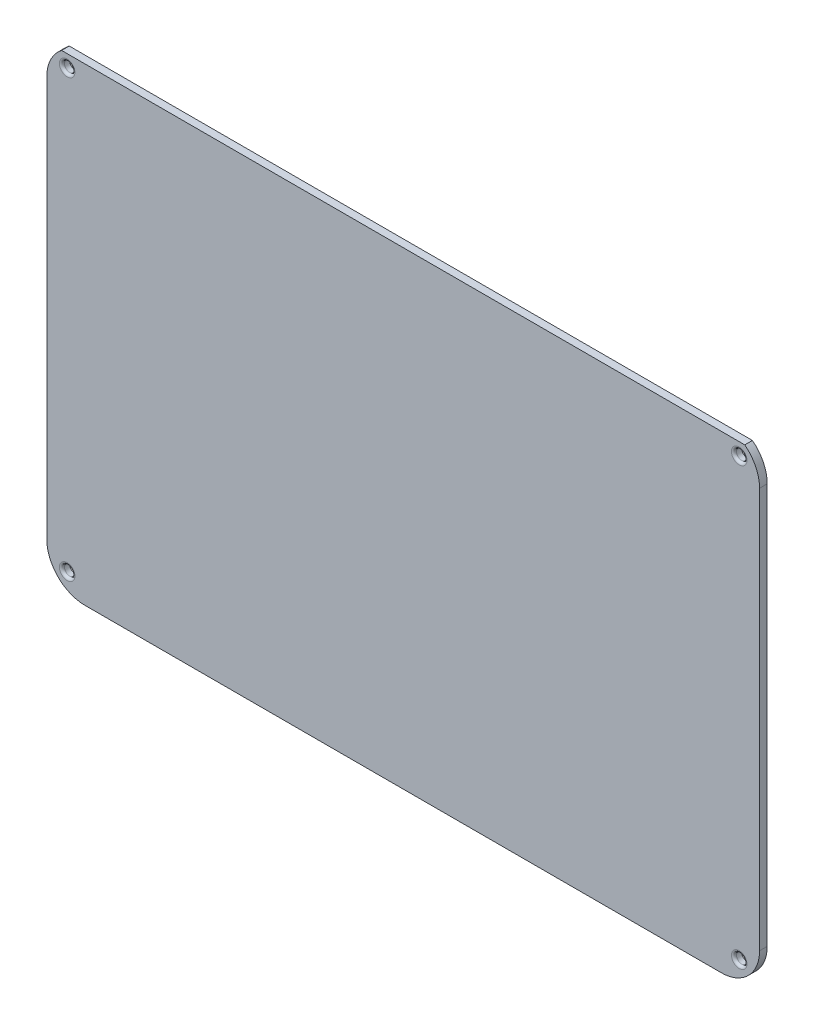
ISO-10303-21;
HEADER;
FILE_DESCRIPTION(('STEP AP214'),'2;1');
FILE_NAME('part.step','',(''),(''),'','','');
FILE_SCHEMA(('AUTOMOTIVE_DESIGN { 1 0 10303 214 1 1 1 1 }'));
ENDSEC;
DATA;
#1=APPLICATION_CONTEXT('core data for automotive mechanical design processes');
#2=APPLICATION_PROTOCOL_DEFINITION('international standard','automotive_design',2000,#1);
#3=PRODUCT_CONTEXT('',#1,'mechanical');
#4=PRODUCT('Part','Part','',(#3));
#5=PRODUCT_RELATED_PRODUCT_CATEGORY('part','',(#4));
#6=PRODUCT_DEFINITION_FORMATION('','',#4);
#7=PRODUCT_DEFINITION_CONTEXT('part definition',#1,'design');
#8=PRODUCT_DEFINITION('design','',#6,#7);
#9=PRODUCT_DEFINITION_SHAPE('','',#8);
#10=(LENGTH_UNIT() NAMED_UNIT(*) SI_UNIT(.MILLI.,.METRE.));
#11=(NAMED_UNIT(*) PLANE_ANGLE_UNIT() SI_UNIT($,.RADIAN.));
#12=(NAMED_UNIT(*) SI_UNIT($,.STERADIAN.) SOLID_ANGLE_UNIT());
#13=UNCERTAINTY_MEASURE_WITH_UNIT(LENGTH_MEASURE(1.E-05),#10,'distance_accuracy_value','');
#14=(GEOMETRIC_REPRESENTATION_CONTEXT(3) GLOBAL_UNCERTAINTY_ASSIGNED_CONTEXT((#13)) GLOBAL_UNIT_ASSIGNED_CONTEXT((#10,
#11,#12)) REPRESENTATION_CONTEXT('',''));
#15=CARTESIAN_POINT('',(0.,0.,0.));
#16=DIRECTION('',(0.,0.,1.));
#17=DIRECTION('',(1.,0.,0.));
#18=AXIS2_PLACEMENT_3D('',#15,#16,#17);
#19=CARTESIAN_POINT('',(0.,0.,0.));
#20=DIRECTION('',(0.,0.,1.));
#21=DIRECTION('',(1.,0.,0.));
#22=AXIS2_PLACEMENT_3D('',#19,#20,#21);
#23=PLANE('',#22);
#24=DIRECTION('',(1.,0.,0.));
#25=VECTOR('',#24,1.);
#26=CARTESIAN_POINT('',(0.,0.,0.));
#27=LINE('',#26,#25);
#28=CARTESIAN_POINT('',(-125.,0.,0.));
#29=VERTEX_POINT('',#28);
#30=CARTESIAN_POINT('',(125.,0.,0.));
#31=VERTEX_POINT('',#30);
#32=EDGE_CURVE('E233',#29,#31,#27,.T.);
#33=ORIENTED_EDGE('',*,*,#32,.F.);
#34=CARTESIAN_POINT('',(-125.,15.,0.));
#35=DIRECTION('',(0.,0.,1.));
#36=DIRECTION('',(1.,0.,0.));
#37=AXIS2_PLACEMENT_3D('',#34,#35,#36);
#38=CIRCLE('',#37,15.);
#39=CARTESIAN_POINT('',(-140.,15.,0.));
#40=VERTEX_POINT('',#39);
#41=EDGE_CURVE('E199',#40,#29,#38,.T.);
#42=ORIENTED_EDGE('',*,*,#41,.F.);
#43=DIRECTION('',(0.,1.,0.));
#44=VECTOR('',#43,1.);
#45=CARTESIAN_POINT('',(-140.,0.,0.));
#46=LINE('',#45,#44);
#47=CARTESIAN_POINT('',(-140.,172.349939951952,0.));
#48=VERTEX_POINT('',#47);
#49=EDGE_CURVE('E253',#40,#48,#46,.T.);
#50=ORIENTED_EDGE('',*,*,#49,.T.);
#51=CARTESIAN_POINT('',(-125.,172.349939951952,0.));
#52=DIRECTION('',(0.,0.,1.));
#53=DIRECTION('',(1.,0.,0.));
#54=AXIS2_PLACEMENT_3D('',#51,#52,#53);
#55=CIRCLE('',#54,15.);
#56=CARTESIAN_POINT('',(-134.189468511492,184.20547319497,0.));
#57=VERTEX_POINT('',#56);
#58=EDGE_CURVE('E249',#57,#48,#55,.T.);
#59=ORIENTED_EDGE('',*,*,#58,.F.);
#60=DIRECTION('',(-1.,0.,0.));
#61=VECTOR('',#60,1.);
#62=CARTESIAN_POINT('',(0.,184.20547319497,0.));
#63=LINE('',#62,#61);
#64=CARTESIAN_POINT('',(134.189468511492,184.20547319497,0.));
#65=VERTEX_POINT('',#64);
#66=EDGE_CURVE('E246',#65,#57,#63,.T.);
#67=ORIENTED_EDGE('',*,*,#66,.F.);
#68=CARTESIAN_POINT('',(125.,172.349939951952,0.));
#69=DIRECTION('',(0.,0.,1.));
#70=DIRECTION('',(1.,0.,0.));
#71=AXIS2_PLACEMENT_3D('',#68,#69,#70);
#72=CIRCLE('',#71,15.);
#73=CARTESIAN_POINT('',(140.,172.349939951952,0.));
#74=VERTEX_POINT('',#73);
#75=EDGE_CURVE('E243',#74,#65,#72,.T.);
#76=ORIENTED_EDGE('',*,*,#75,.F.);
#77=DIRECTION('',(0.,1.,0.));
#78=VECTOR('',#77,1.);
#79=CARTESIAN_POINT('',(140.,0.,0.));
#80=LINE('',#79,#78);
#81=CARTESIAN_POINT('',(140.,15.,0.));
#82=VERTEX_POINT('',#81);
#83=EDGE_CURVE('E240',#82,#74,#80,.T.);
#84=ORIENTED_EDGE('',*,*,#83,.F.);
#85=CARTESIAN_POINT('',(125.,15.,0.));
#86=DIRECTION('',(0.,0.,1.));
#87=DIRECTION('',(1.,0.,0.));
#88=AXIS2_PLACEMENT_3D('',#85,#86,#87);
#89=CIRCLE('',#88,15.);
#90=EDGE_CURVE('E237',#31,#82,#89,.T.);
#91=ORIENTED_EDGE('',*,*,#90,.F.);
#92=EDGE_LOOP('',(#33,#42,#50,#59,#67,#76,#84,#91));
#93=FACE_BOUND('',#92,.T.);
#94=CARTESIAN_POINT('',(132.,179.349939951952,0.));
#95=DIRECTION('',(0.,0.,1.));
#96=DIRECTION('',(1.,0.,0.));
#97=AXIS2_PLACEMENT_3D('',#94,#95,#96);
#98=CIRCLE('',#97,2.04999999999999);
#99=CARTESIAN_POINT('',(134.05,179.349939951952,0.));
#100=VERTEX_POINT('',#99);
#101=EDGE_CURVE('E229',#100,#100,#98,.T.);
#102=ORIENTED_EDGE('',*,*,#101,.T.);
#103=EDGE_LOOP('',(#102));
#104=FACE_BOUND('',#103,.T.);
#105=CARTESIAN_POINT('',(132.,8.,0.));
#106=DIRECTION('',(0.,0.,1.));
#107=DIRECTION('',(1.,0.,0.));
#108=AXIS2_PLACEMENT_3D('',#105,#106,#107);
#109=CIRCLE('',#108,2.04999999999999);
#110=CARTESIAN_POINT('',(134.05,8.,0.));
#111=VERTEX_POINT('',#110);
#112=EDGE_CURVE('E225',#111,#111,#109,.T.);
#113=ORIENTED_EDGE('',*,*,#112,.T.);
#114=EDGE_LOOP('',(#113));
#115=FACE_BOUND('',#114,.T.);
#116=CARTESIAN_POINT('',(-132.,8.,0.));
#117=DIRECTION('',(0.,0.,1.));
#118=DIRECTION('',(1.,0.,0.));
#119=AXIS2_PLACEMENT_3D('',#116,#117,#118);
#120=CIRCLE('',#119,2.04999999999999);
#121=CARTESIAN_POINT('',(-129.95,8.,0.));
#122=VERTEX_POINT('',#121);
#123=EDGE_CURVE('E188',#122,#122,#120,.T.);
#124=ORIENTED_EDGE('',*,*,#123,.T.);
#125=EDGE_LOOP('',(#124));
#126=FACE_BOUND('',#125,.T.);
#127=CARTESIAN_POINT('',(-132.,179.349939951952,0.));
#128=DIRECTION('',(0.,0.,1.));
#129=DIRECTION('',(1.,0.,0.));
#130=AXIS2_PLACEMENT_3D('',#127,#128,#129);
#131=CIRCLE('',#130,2.04999999999999);
#132=CARTESIAN_POINT('',(-129.95,179.349939951952,0.));
#133=VERTEX_POINT('',#132);
#134=EDGE_CURVE('E183',#133,#133,#131,.T.);
#135=ORIENTED_EDGE('',*,*,#134,.T.);
#136=EDGE_LOOP('',(#135));
#137=FACE_BOUND('',#136,.T.);
#138=CARTESIAN_POINT('',(-125.,10.,0.));
#139=DIRECTION('',(0.,0.,-1.));
#140=DIRECTION('',(-1.,0.,0.));
#141=AXIS2_PLACEMENT_3D('',#138,#139,#140);
#142=CIRCLE('',#141,1.59999999999999);
#143=CARTESIAN_POINT('',(-125.,8.40000000000001,0.));
#144=VERTEX_POINT('',#143);
#145=CARTESIAN_POINT('',(-126.6,10.,0.));
#146=VERTEX_POINT('',#145);
#147=EDGE_CURVE('E181',#144,#146,#142,.T.);
#148=ORIENTED_EDGE('',*,*,#147,.F.);
#149=DIRECTION('',(-1.,0.,0.));
#150=VECTOR('',#149,1.);
#151=CARTESIAN_POINT('',(125.,8.4,0.));
#152=LINE('',#151,#150);
#153=CARTESIAN_POINT('',(125.,8.4,0.));
#154=VERTEX_POINT('',#153);
#155=EDGE_CURVE('E178',#154,#144,#152,.T.);
#156=ORIENTED_EDGE('',*,*,#155,.F.);
#157=CARTESIAN_POINT('',(125.,10.,0.));
#158=DIRECTION('',(0.,0.,-1.));
#159=DIRECTION('',(-1.,0.,0.));
#160=AXIS2_PLACEMENT_3D('',#157,#158,#159);
#161=CIRCLE('',#160,1.59999999999997);
#162=CARTESIAN_POINT('',(126.6,10.,0.));
#163=VERTEX_POINT('',#162);
#164=EDGE_CURVE('E415',#163,#154,#161,.T.);
#165=ORIENTED_EDGE('',*,*,#164,.F.);
#166=DIRECTION('',(0.,-1.,0.));
#167=VECTOR('',#166,1.);
#168=CARTESIAN_POINT('',(126.6,177.349939951952,0.));
#169=LINE('',#168,#167);
#170=CARTESIAN_POINT('',(126.6,177.349939951952,0.));
#171=VERTEX_POINT('',#170);
#172=EDGE_CURVE('E460',#171,#163,#169,.T.);
#173=ORIENTED_EDGE('',*,*,#172,.F.);
#174=CARTESIAN_POINT('',(125.,177.349939951952,0.));
#175=DIRECTION('',(0.,0.,-1.));
#176=DIRECTION('',(-1.,0.,0.));
#177=AXIS2_PLACEMENT_3D('',#174,#175,#176);
#178=CIRCLE('',#177,1.59999999999999);
#179=CARTESIAN_POINT('',(125.,178.949939951952,0.));
#180=VERTEX_POINT('',#179);
#181=EDGE_CURVE('E453',#180,#171,#178,.T.);
#182=ORIENTED_EDGE('',*,*,#181,.F.);
#183=DIRECTION('',(1.,0.,0.));
#184=VECTOR('',#183,1.);
#185=CARTESIAN_POINT('',(-125.,178.949939951952,0.));
#186=LINE('',#185,#184);
#187=CARTESIAN_POINT('',(-125.,178.949939951952,0.));
#188=VERTEX_POINT('',#187);
#189=EDGE_CURVE('E445',#188,#180,#186,.T.);
#190=ORIENTED_EDGE('',*,*,#189,.F.);
#191=CARTESIAN_POINT('',(-125.,177.349939951952,0.));
#192=DIRECTION('',(0.,0.,-1.));
#193=DIRECTION('',(-1.,0.,0.));
#194=AXIS2_PLACEMENT_3D('',#191,#192,#193);
#195=CIRCLE('',#194,1.59999999999999);
#196=CARTESIAN_POINT('',(-126.6,177.349939951952,0.));
#197=VERTEX_POINT('',#196);
#198=EDGE_CURVE('E66',#197,#188,#195,.T.);
#199=ORIENTED_EDGE('',*,*,#198,.F.);
#200=DIRECTION('',(0.,1.,0.));
#201=VECTOR('',#200,1.);
#202=CARTESIAN_POINT('',(-126.6,10.,0.));
#203=LINE('',#202,#201);
#204=EDGE_CURVE('E61',#146,#197,#203,.T.);
#205=ORIENTED_EDGE('',*,*,#204,.F.);
#206=EDGE_LOOP('',(#148,#156,#165,#173,#182,#190,#199,#205));
#207=FACE_BOUND('',#206,.T.);
#208=ADVANCED_FACE('F45',(#93,#104,#115,#126,#137,#207),#23,.F.);
#209=CARTESIAN_POINT('',(0.,0.,3.));
#210=DIRECTION('',(0.,1.,0.));
#211=DIRECTION('',(0.,0.,1.));
#212=AXIS2_PLACEMENT_3D('',#209,#210,#211);
#213=PLANE('',#212);
#214=ORIENTED_EDGE('',*,*,#32,.T.);
#215=DIRECTION('',(0.,0.,-1.));
#216=VECTOR('',#215,1.);
#217=CARTESIAN_POINT('',(125.,0.,3.));
#218=LINE('',#217,#216);
#219=CARTESIAN_POINT('',(125.,0.,3.));
#220=VERTEX_POINT('',#219);
#221=EDGE_CURVE('E284',#220,#31,#218,.T.);
#222=ORIENTED_EDGE('',*,*,#221,.F.);
#223=DIRECTION('',(1.,0.,0.));
#224=VECTOR('',#223,1.);
#225=CARTESIAN_POINT('',(0.,0.,3.));
#226=LINE('',#225,#224);
#227=CARTESIAN_POINT('',(-125.,0.,3.));
#228=VERTEX_POINT('',#227);
#229=EDGE_CURVE('E194',#228,#220,#226,.T.);
#230=ORIENTED_EDGE('',*,*,#229,.F.);
#231=DIRECTION('',(0.,0.,-1.));
#232=VECTOR('',#231,1.);
#233=CARTESIAN_POINT('',(-125.,0.,3.));
#234=LINE('',#233,#232);
#235=EDGE_CURVE('E220',#228,#29,#234,.T.);
#236=ORIENTED_EDGE('',*,*,#235,.T.);
#237=EDGE_LOOP('',(#214,#222,#230,#236));
#238=FACE_BOUND('',#237,.T.);
#239=ADVANCED_FACE('F332',(#238),#213,.F.);
#240=CARTESIAN_POINT('',(125.,15.,3.));
#241=DIRECTION('',(0.,0.,-1.));
#242=DIRECTION('',(-1.,0.,0.));
#243=AXIS2_PLACEMENT_3D('',#240,#241,#242);
#244=CYLINDRICAL_SURFACE('',#243,15.);
#245=ORIENTED_EDGE('',*,*,#90,.T.);
#246=DIRECTION('',(0.,0.,-1.));
#247=VECTOR('',#246,1.);
#248=CARTESIAN_POINT('',(140.,15.,3.));
#249=LINE('',#248,#247);
#250=CARTESIAN_POINT('',(140.,15.,3.));
#251=VERTEX_POINT('',#250);
#252=EDGE_CURVE('E280',#251,#82,#249,.T.);
#253=ORIENTED_EDGE('',*,*,#252,.F.);
#254=CARTESIAN_POINT('',(125.,15.,3.));
#255=DIRECTION('',(0.,0.,1.));
#256=DIRECTION('',(1.,0.,0.));
#257=AXIS2_PLACEMENT_3D('',#254,#255,#256);
#258=CIRCLE('',#257,15.);
#259=EDGE_CURVE('E198',#220,#251,#258,.T.);
#260=ORIENTED_EDGE('',*,*,#259,.F.);
#261=ORIENTED_EDGE('',*,*,#221,.T.);
#262=EDGE_LOOP('',(#245,#253,#260,#261));
#263=FACE_BOUND('',#262,.T.);
#264=ADVANCED_FACE('F340',(#263),#244,.T.);
#265=CARTESIAN_POINT('',(140.,0.,3.));
#266=DIRECTION('',(-1.,0.,0.));
#267=DIRECTION('',(0.,0.,1.));
#268=AXIS2_PLACEMENT_3D('',#265,#266,#267);
#269=PLANE('',#268);
#270=ORIENTED_EDGE('',*,*,#83,.T.);
#271=DIRECTION('',(0.,0.,-1.));
#272=VECTOR('',#271,1.);
#273=CARTESIAN_POINT('',(140.,172.349939951952,3.));
#274=LINE('',#273,#272);
#275=CARTESIAN_POINT('',(140.,172.349939951952,3.));
#276=VERTEX_POINT('',#275);
#277=EDGE_CURVE('E276',#276,#74,#274,.T.);
#278=ORIENTED_EDGE('',*,*,#277,.F.);
#279=DIRECTION('',(0.,1.,0.));
#280=VECTOR('',#279,1.);
#281=CARTESIAN_POINT('',(140.,0.,3.));
#282=LINE('',#281,#280);
#283=EDGE_CURVE('E202',#251,#276,#282,.T.);
#284=ORIENTED_EDGE('',*,*,#283,.F.);
#285=ORIENTED_EDGE('',*,*,#252,.T.);
#286=EDGE_LOOP('',(#270,#278,#284,#285));
#287=FACE_BOUND('',#286,.T.);
#288=ADVANCED_FACE('F368',(#287),#269,.F.);
#289=CARTESIAN_POINT('',(125.,172.349939951952,3.));
#290=DIRECTION('',(0.,0.,-1.));
#291=DIRECTION('',(-1.,0.,0.));
#292=AXIS2_PLACEMENT_3D('',#289,#290,#291);
#293=CYLINDRICAL_SURFACE('',#292,15.);
#294=ORIENTED_EDGE('',*,*,#75,.T.);
#295=DIRECTION('',(0.,0.,-1.));
#296=VECTOR('',#295,1.);
#297=CARTESIAN_POINT('',(134.189468511492,184.20547319497,3.));
#298=LINE('',#297,#296);
#299=CARTESIAN_POINT('',(134.189468511492,184.20547319497,3.));
#300=VERTEX_POINT('',#299);
#301=EDGE_CURVE('E272',#300,#65,#298,.T.);
#302=ORIENTED_EDGE('',*,*,#301,.F.);
#303=CARTESIAN_POINT('',(125.,172.349939951952,3.));
#304=DIRECTION('',(0.,0.,1.));
#305=DIRECTION('',(1.,0.,0.));
#306=AXIS2_PLACEMENT_3D('',#303,#304,#305);
#307=CIRCLE('',#306,15.);
#308=EDGE_CURVE('E205',#276,#300,#307,.T.);
#309=ORIENTED_EDGE('',*,*,#308,.F.);
#310=ORIENTED_EDGE('',*,*,#277,.T.);
#311=EDGE_LOOP('',(#294,#302,#309,#310));
#312=FACE_BOUND('',#311,.T.);
#313=ADVANCED_FACE('F364',(#312),#293,.T.);
#314=CARTESIAN_POINT('',(0.,184.20547319497,3.));
#315=DIRECTION('',(0.,-1.,0.));
#316=DIRECTION('',(0.,0.,-1.));
#317=AXIS2_PLACEMENT_3D('',#314,#315,#316);
#318=PLANE('',#317);
#319=ORIENTED_EDGE('',*,*,#66,.T.);
#320=DIRECTION('',(0.,0.,-1.));
#321=VECTOR('',#320,1.);
#322=CARTESIAN_POINT('',(-134.189468511492,184.20547319497,3.));
#323=LINE('',#322,#321);
#324=CARTESIAN_POINT('',(-134.189468511492,184.20547319497,3.));
#325=VERTEX_POINT('',#324);
#326=EDGE_CURVE('E268',#325,#57,#323,.T.);
#327=ORIENTED_EDGE('',*,*,#326,.F.);
#328=DIRECTION('',(-1.,0.,0.));
#329=VECTOR('',#328,1.);
#330=CARTESIAN_POINT('',(0.,184.20547319497,3.));
#331=LINE('',#330,#329);
#332=EDGE_CURVE('E208',#300,#325,#331,.T.);
#333=ORIENTED_EDGE('',*,*,#332,.F.);
#334=ORIENTED_EDGE('',*,*,#301,.T.);
#335=EDGE_LOOP('',(#319,#327,#333,#334));
#336=FACE_BOUND('',#335,.T.);
#337=ADVANCED_FACE('F360',(#336),#318,.F.);
#338=CARTESIAN_POINT('',(-125.,172.349939951952,3.));
#339=DIRECTION('',(0.,0.,-1.));
#340=DIRECTION('',(-1.,0.,0.));
#341=AXIS2_PLACEMENT_3D('',#338,#339,#340);
#342=CYLINDRICAL_SURFACE('',#341,15.);
#343=ORIENTED_EDGE('',*,*,#58,.T.);
#344=DIRECTION('',(0.,0.,-1.));
#345=VECTOR('',#344,1.);
#346=CARTESIAN_POINT('',(-140.,172.349939951952,3.));
#347=LINE('',#346,#345);
#348=CARTESIAN_POINT('',(-140.,172.349939951952,3.));
#349=VERTEX_POINT('',#348);
#350=EDGE_CURVE('E265',#349,#48,#347,.T.);
#351=ORIENTED_EDGE('',*,*,#350,.F.);
#352=CARTESIAN_POINT('',(-125.,172.349939951952,3.));
#353=DIRECTION('',(0.,0.,1.));
#354=DIRECTION('',(1.,0.,0.));
#355=AXIS2_PLACEMENT_3D('',#352,#353,#354);
#356=CIRCLE('',#355,15.);
#357=EDGE_CURVE('E211',#325,#349,#356,.T.);
#358=ORIENTED_EDGE('',*,*,#357,.F.);
#359=ORIENTED_EDGE('',*,*,#326,.T.);
#360=EDGE_LOOP('',(#343,#351,#358,#359));
#361=FACE_BOUND('',#360,.T.);
#362=ADVANCED_FACE('F356',(#361),#342,.T.);
#363=CARTESIAN_POINT('',(-140.,0.,3.));
#364=DIRECTION('',(-1.,0.,0.));
#365=DIRECTION('',(0.,0.,1.));
#366=AXIS2_PLACEMENT_3D('',#363,#364,#365);
#367=PLANE('',#366);
#368=ORIENTED_EDGE('',*,*,#49,.F.);
#369=DIRECTION('',(0.,0.,-1.));
#370=VECTOR('',#369,1.);
#371=CARTESIAN_POINT('',(-140.,15.,3.));
#372=LINE('',#371,#370);
#373=CARTESIAN_POINT('',(-140.,15.,3.));
#374=VERTEX_POINT('',#373);
#375=EDGE_CURVE('E262',#374,#40,#372,.T.);
#376=ORIENTED_EDGE('',*,*,#375,.F.);
#377=DIRECTION('',(0.,1.,0.));
#378=VECTOR('',#377,1.);
#379=CARTESIAN_POINT('',(-140.,0.,3.));
#380=LINE('',#379,#378);
#381=EDGE_CURVE('E214',#374,#349,#380,.T.);
#382=ORIENTED_EDGE('',*,*,#381,.T.);
#383=ORIENTED_EDGE('',*,*,#350,.T.);
#384=EDGE_LOOP('',(#368,#376,#382,#383));
#385=FACE_BOUND('',#384,.T.);
#386=ADVANCED_FACE('F353',(#385),#367,.T.);
#387=CARTESIAN_POINT('',(132.,179.349939951952,3.));
#388=DIRECTION('',(0.,0.,-1.));
#389=DIRECTION('',(-1.,0.,0.));
#390=AXIS2_PLACEMENT_3D('',#387,#388,#389);
#391=CYLINDRICAL_SURFACE('',#390,2.04999999999999);
#392=CARTESIAN_POINT('',(132.,179.349939951952,2.));
#393=DIRECTION('',(0.,0.,1.));
#394=DIRECTION('',(1.,0.,0.));
#395=AXIS2_PLACEMENT_3D('',#392,#393,#394);
#396=CIRCLE('',#395,2.04999999999999);
#397=CARTESIAN_POINT('',(134.05,179.349939951952,2.));
#398=VERTEX_POINT('',#397);
#399=EDGE_CURVE('E54',#398,#398,#396,.T.);
#400=ORIENTED_EDGE('',*,*,#399,.T.);
#401=EDGE_LOOP('',(#400));
#402=FACE_BOUND('',#401,.T.);
#403=ORIENTED_EDGE('',*,*,#101,.F.);
#404=EDGE_LOOP('',(#403));
#405=FACE_BOUND('',#404,.T.);
#406=ADVANCED_FACE('F315',(#402,#405),#391,.F.);
#407=CARTESIAN_POINT('',(132.,8.,3.));
#408=DIRECTION('',(0.,0.,-1.));
#409=DIRECTION('',(-1.,0.,0.));
#410=AXIS2_PLACEMENT_3D('',#407,#408,#409);
#411=CYLINDRICAL_SURFACE('',#410,2.04999999999999);
#412=CARTESIAN_POINT('',(132.,8.,2.));
#413=DIRECTION('',(0.,0.,1.));
#414=DIRECTION('',(1.,0.,0.));
#415=AXIS2_PLACEMENT_3D('',#412,#413,#414);
#416=CIRCLE('',#415,2.04999999999999);
#417=CARTESIAN_POINT('',(134.05,8.,2.));
#418=VERTEX_POINT('',#417);
#419=EDGE_CURVE('E11',#418,#418,#416,.T.);
#420=ORIENTED_EDGE('',*,*,#419,.T.);
#421=EDGE_LOOP('',(#420));
#422=FACE_BOUND('',#421,.T.);
#423=ORIENTED_EDGE('',*,*,#112,.F.);
#424=EDGE_LOOP('',(#423));
#425=FACE_BOUND('',#424,.T.);
#426=ADVANCED_FACE('F378',(#422,#425),#411,.F.);
#427=CARTESIAN_POINT('',(-132.,8.,3.));
#428=DIRECTION('',(0.,0.,-1.));
#429=DIRECTION('',(-1.,0.,0.));
#430=AXIS2_PLACEMENT_3D('',#427,#428,#429);
#431=CYLINDRICAL_SURFACE('',#430,2.04999999999999);
#432=CARTESIAN_POINT('',(-132.,8.,2.));
#433=DIRECTION('',(0.,0.,1.));
#434=DIRECTION('',(1.,0.,0.));
#435=AXIS2_PLACEMENT_3D('',#432,#433,#434);
#436=CIRCLE('',#435,2.04999999999999);
#437=CARTESIAN_POINT('',(-129.95,8.,2.));
#438=VERTEX_POINT('',#437);
#439=EDGE_CURVE('E288',#438,#438,#436,.T.);
#440=ORIENTED_EDGE('',*,*,#439,.T.);
#441=EDGE_LOOP('',(#440));
#442=FACE_BOUND('',#441,.T.);
#443=ORIENTED_EDGE('',*,*,#123,.F.);
#444=EDGE_LOOP('',(#443));
#445=FACE_BOUND('',#444,.T.);
#446=ADVANCED_FACE('F381',(#442,#445),#431,.F.);
#447=CARTESIAN_POINT('',(-132.,179.349939951952,3.));
#448=DIRECTION('',(0.,0.,-1.));
#449=DIRECTION('',(-1.,0.,0.));
#450=AXIS2_PLACEMENT_3D('',#447,#448,#449);
#451=CYLINDRICAL_SURFACE('',#450,2.04999999999999);
#452=CARTESIAN_POINT('',(-132.,179.349939951952,2.));
#453=DIRECTION('',(0.,0.,1.));
#454=DIRECTION('',(1.,0.,0.));
#455=AXIS2_PLACEMENT_3D('',#452,#453,#454);
#456=CIRCLE('',#455,2.04999999999999);
#457=CARTESIAN_POINT('',(-129.95,179.349939951952,2.));
#458=VERTEX_POINT('',#457);
#459=EDGE_CURVE('E308',#458,#458,#456,.T.);
#460=ORIENTED_EDGE('',*,*,#459,.T.);
#461=EDGE_LOOP('',(#460));
#462=FACE_BOUND('',#461,.T.);
#463=ORIENTED_EDGE('',*,*,#134,.F.);
#464=EDGE_LOOP('',(#463));
#465=FACE_BOUND('',#464,.T.);
#466=ADVANCED_FACE('F351',(#462,#465),#451,.F.);
#467=CARTESIAN_POINT('',(-125.,15.,3.));
#468=DIRECTION('',(0.,0.,-1.));
#469=DIRECTION('',(-1.,0.,0.));
#470=AXIS2_PLACEMENT_3D('',#467,#468,#469);
#471=CYLINDRICAL_SURFACE('',#470,15.);
#472=ORIENTED_EDGE('',*,*,#41,.T.);
#473=ORIENTED_EDGE('',*,*,#235,.F.);
#474=CARTESIAN_POINT('',(-125.,15.,3.));
#475=DIRECTION('',(0.,0.,1.));
#476=DIRECTION('',(1.,0.,0.));
#477=AXIS2_PLACEMENT_3D('',#474,#475,#476);
#478=CIRCLE('',#477,15.);
#479=EDGE_CURVE('E218',#374,#228,#478,.T.);
#480=ORIENTED_EDGE('',*,*,#479,.F.);
#481=ORIENTED_EDGE('',*,*,#375,.T.);
#482=EDGE_LOOP('',(#472,#473,#480,#481));
#483=FACE_BOUND('',#482,.T.);
#484=ADVANCED_FACE('F349',(#483),#471,.T.);
#485=CARTESIAN_POINT('',(0.,0.,3.));
#486=DIRECTION('',(0.,0.,1.));
#487=DIRECTION('',(1.,0.,0.));
#488=AXIS2_PLACEMENT_3D('',#485,#486,#487);
#489=PLANE('',#488);
#490=CARTESIAN_POINT('',(-132.,8.,3.));
#491=DIRECTION('',(0.,0.,1.));
#492=DIRECTION('',(1.,0.,0.));
#493=AXIS2_PLACEMENT_3D('',#490,#491,#492);
#494=CIRCLE('',#493,3.04999999999999);
#495=CARTESIAN_POINT('',(-128.95,8.,3.));
#496=VERTEX_POINT('',#495);
#497=EDGE_CURVE('E304',#496,#496,#494,.F.);
#498=ORIENTED_EDGE('',*,*,#497,.T.);
#499=EDGE_LOOP('',(#498));
#500=FACE_BOUND('',#499,.T.);
#501=CARTESIAN_POINT('',(-132.,179.349939951952,3.));
#502=DIRECTION('',(0.,0.,1.));
#503=DIRECTION('',(1.,0.,0.));
#504=AXIS2_PLACEMENT_3D('',#501,#502,#503);
#505=CIRCLE('',#504,3.04999999999999);
#506=CARTESIAN_POINT('',(-128.95,179.349939951952,3.));
#507=VERTEX_POINT('',#506);
#508=EDGE_CURVE('E300',#507,#507,#505,.F.);
#509=ORIENTED_EDGE('',*,*,#508,.T.);
#510=EDGE_LOOP('',(#509));
#511=FACE_BOUND('',#510,.T.);
#512=CARTESIAN_POINT('',(132.,179.349939951952,3.));
#513=DIRECTION('',(0.,0.,1.));
#514=DIRECTION('',(1.,0.,0.));
#515=AXIS2_PLACEMENT_3D('',#512,#513,#514);
#516=CIRCLE('',#515,3.04999999999999);
#517=CARTESIAN_POINT('',(135.05,179.349939951952,3.));
#518=VERTEX_POINT('',#517);
#519=EDGE_CURVE('E296',#518,#518,#516,.F.);
#520=ORIENTED_EDGE('',*,*,#519,.T.);
#521=EDGE_LOOP('',(#520));
#522=FACE_BOUND('',#521,.T.);
#523=CARTESIAN_POINT('',(132.,8.,3.));
#524=DIRECTION('',(0.,0.,1.));
#525=DIRECTION('',(1.,0.,0.));
#526=AXIS2_PLACEMENT_3D('',#523,#524,#525);
#527=CIRCLE('',#526,3.04999999999999);
#528=CARTESIAN_POINT('',(135.05,8.,3.));
#529=VERTEX_POINT('',#528);
#530=EDGE_CURVE('E292',#529,#529,#527,.F.);
#531=ORIENTED_EDGE('',*,*,#530,.T.);
#532=EDGE_LOOP('',(#531));
#533=FACE_BOUND('',#532,.T.);
#534=ORIENTED_EDGE('',*,*,#229,.T.);
#535=ORIENTED_EDGE('',*,*,#259,.T.);
#536=ORIENTED_EDGE('',*,*,#283,.T.);
#537=ORIENTED_EDGE('',*,*,#308,.T.);
#538=ORIENTED_EDGE('',*,*,#332,.T.);
#539=ORIENTED_EDGE('',*,*,#357,.T.);
#540=ORIENTED_EDGE('',*,*,#381,.F.);
#541=ORIENTED_EDGE('',*,*,#479,.T.);
#542=EDGE_LOOP('',(#534,#535,#536,#537,#538,#539,#540,#541));
#543=FACE_BOUND('',#542,.T.);
#544=ADVANCED_FACE('F347',(#500,#511,#522,#533,#543),#489,.T.);
#545=CARTESIAN_POINT('',(-125.,10.,-3.));
#546=DIRECTION('',(0.,0.,1.));
#547=DIRECTION('',(1.,0.,0.));
#548=AXIS2_PLACEMENT_3D('',#545,#546,#547);
#549=CYLINDRICAL_SURFACE('',#548,1.59999999999999);
#550=ORIENTED_EDGE('',*,*,#147,.T.);
#551=DIRECTION('',(0.,0.,1.));
#552=VECTOR('',#551,1.);
#553=CARTESIAN_POINT('',(-126.6,10.,-3.));
#554=LINE('',#553,#552);
#555=CARTESIAN_POINT('',(-126.6,10.,-3.));
#556=VERTEX_POINT('',#555);
#557=EDGE_CURVE('E160',#556,#146,#554,.T.);
#558=ORIENTED_EDGE('',*,*,#557,.F.);
#559=CARTESIAN_POINT('',(-125.,10.,-3.));
#560=DIRECTION('',(0.,0.,-1.));
#561=DIRECTION('',(-1.,0.,0.));
#562=AXIS2_PLACEMENT_3D('',#559,#560,#561);
#563=CIRCLE('',#562,1.59999999999999);
#564=CARTESIAN_POINT('',(-125.,8.40000000000001,-3.));
#565=VERTEX_POINT('',#564);
#566=EDGE_CURVE('E168',#565,#556,#563,.T.);
#567=ORIENTED_EDGE('',*,*,#566,.F.);
#568=DIRECTION('',(0.,0.,1.));
#569=VECTOR('',#568,1.);
#570=CARTESIAN_POINT('',(-125.,8.40000000000001,-3.));
#571=LINE('',#570,#569);
#572=EDGE_CURVE('E411',#565,#144,#571,.T.);
#573=ORIENTED_EDGE('',*,*,#572,.T.);
#574=EDGE_LOOP('',(#550,#558,#567,#573));
#575=FACE_BOUND('',#574,.T.);
#576=ADVANCED_FACE('F180',(#575),#549,.T.);
#577=CARTESIAN_POINT('',(-126.6,10.,-3.));
#578=DIRECTION('',(1.,0.,0.));
#579=DIRECTION('',(0.,0.,-1.));
#580=AXIS2_PLACEMENT_3D('',#577,#578,#579);
#581=PLANE('',#580);
#582=ORIENTED_EDGE('',*,*,#204,.T.);
#583=DIRECTION('',(0.,0.,1.));
#584=VECTOR('',#583,1.);
#585=CARTESIAN_POINT('',(-126.6,177.349939951952,-3.));
#586=LINE('',#585,#584);
#587=CARTESIAN_POINT('',(-126.6,177.349939951952,-3.));
#588=VERTEX_POINT('',#587);
#589=EDGE_CURVE('E163',#588,#197,#586,.T.);
#590=ORIENTED_EDGE('',*,*,#589,.F.);
#591=DIRECTION('',(0.,1.,0.));
#592=VECTOR('',#591,1.);
#593=CARTESIAN_POINT('',(-126.6,10.,-3.));
#594=LINE('',#593,#592);
#595=EDGE_CURVE('E156',#556,#588,#594,.T.);
#596=ORIENTED_EDGE('',*,*,#595,.F.);
#597=ORIENTED_EDGE('',*,*,#557,.T.);
#598=EDGE_LOOP('',(#582,#590,#596,#597));
#599=FACE_BOUND('',#598,.T.);
#600=ADVANCED_FACE('F158',(#599),#581,.F.);
#601=CARTESIAN_POINT('',(-125.,177.349939951952,-3.));
#602=DIRECTION('',(0.,0.,1.));
#603=DIRECTION('',(1.,0.,0.));
#604=AXIS2_PLACEMENT_3D('',#601,#602,#603);
#605=CYLINDRICAL_SURFACE('',#604,1.59999999999999);
#606=ORIENTED_EDGE('',*,*,#198,.T.);
#607=DIRECTION('',(0.,0.,1.));
#608=VECTOR('',#607,1.);
#609=CARTESIAN_POINT('',(-125.,178.949939951952,-3.));
#610=LINE('',#609,#608);
#611=CARTESIAN_POINT('',(-125.,178.949939951952,-3.));
#612=VERTEX_POINT('',#611);
#613=EDGE_CURVE('E190',#612,#188,#610,.T.);
#614=ORIENTED_EDGE('',*,*,#613,.F.);
#615=CARTESIAN_POINT('',(-125.,177.349939951952,-3.));
#616=DIRECTION('',(0.,0.,-1.));
#617=DIRECTION('',(-1.,0.,0.));
#618=AXIS2_PLACEMENT_3D('',#615,#616,#617);
#619=CIRCLE('',#618,1.59999999999999);
#620=EDGE_CURVE('E167',#588,#612,#619,.T.);
#621=ORIENTED_EDGE('',*,*,#620,.F.);
#622=ORIENTED_EDGE('',*,*,#589,.T.);
#623=EDGE_LOOP('',(#606,#614,#621,#622));
#624=FACE_BOUND('',#623,.T.);
#625=ADVANCED_FACE('F448',(#624),#605,.T.);
#626=CARTESIAN_POINT('',(-125.,178.949939951952,-3.));
#627=DIRECTION('',(0.,-1.,0.));
#628=DIRECTION('',(0.,0.,-1.));
#629=AXIS2_PLACEMENT_3D('',#626,#627,#628);
#630=PLANE('',#629);
#631=ORIENTED_EDGE('',*,*,#189,.T.);
#632=DIRECTION('',(0.,0.,1.));
#633=VECTOR('',#632,1.);
#634=CARTESIAN_POINT('',(125.,178.949939951952,-3.));
#635=LINE('',#634,#633);
#636=CARTESIAN_POINT('',(125.,178.949939951952,-3.));
#637=VERTEX_POINT('',#636);
#638=EDGE_CURVE('E434',#637,#180,#635,.T.);
#639=ORIENTED_EDGE('',*,*,#638,.F.);
#640=DIRECTION('',(1.,0.,0.));
#641=VECTOR('',#640,1.);
#642=CARTESIAN_POINT('',(-125.,178.949939951952,-3.));
#643=LINE('',#642,#641);
#644=EDGE_CURVE('E446',#612,#637,#643,.T.);
#645=ORIENTED_EDGE('',*,*,#644,.F.);
#646=ORIENTED_EDGE('',*,*,#613,.T.);
#647=EDGE_LOOP('',(#631,#639,#645,#646));
#648=FACE_BOUND('',#647,.T.);
#649=ADVANCED_FACE('F443',(#648),#630,.F.);
#650=CARTESIAN_POINT('',(125.,177.349939951952,-3.));
#651=DIRECTION('',(0.,0.,1.));
#652=DIRECTION('',(1.,0.,0.));
#653=AXIS2_PLACEMENT_3D('',#650,#651,#652);
#654=CYLINDRICAL_SURFACE('',#653,1.59999999999999);
#655=ORIENTED_EDGE('',*,*,#181,.T.);
#656=DIRECTION('',(0.,0.,1.));
#657=VECTOR('',#656,1.);
#658=CARTESIAN_POINT('',(126.6,177.349939951952,-3.));
#659=LINE('',#658,#657);
#660=CARTESIAN_POINT('',(126.6,177.349939951952,-3.));
#661=VERTEX_POINT('',#660);
#662=EDGE_CURVE('E430',#661,#171,#659,.T.);
#663=ORIENTED_EDGE('',*,*,#662,.F.);
#664=CARTESIAN_POINT('',(125.,177.349939951952,-3.));
#665=DIRECTION('',(0.,0.,-1.));
#666=DIRECTION('',(-1.,0.,0.));
#667=AXIS2_PLACEMENT_3D('',#664,#665,#666);
#668=CIRCLE('',#667,1.59999999999999);
#669=EDGE_CURVE('E476',#637,#661,#668,.T.);
#670=ORIENTED_EDGE('',*,*,#669,.F.);
#671=ORIENTED_EDGE('',*,*,#638,.T.);
#672=EDGE_LOOP('',(#655,#663,#670,#671));
#673=FACE_BOUND('',#672,.T.);
#674=ADVANCED_FACE('F475',(#673),#654,.T.);
#675=CARTESIAN_POINT('',(126.6,177.349939951952,-3.));
#676=DIRECTION('',(-1.,0.,0.));
#677=DIRECTION('',(0.,0.,1.));
#678=AXIS2_PLACEMENT_3D('',#675,#676,#677);
#679=PLANE('',#678);
#680=ORIENTED_EDGE('',*,*,#172,.T.);
#681=DIRECTION('',(0.,0.,1.));
#682=VECTOR('',#681,1.);
#683=CARTESIAN_POINT('',(126.6,10.,-3.));
#684=LINE('',#683,#682);
#685=CARTESIAN_POINT('',(126.6,10.,-3.));
#686=VERTEX_POINT('',#685);
#687=EDGE_CURVE('E421',#686,#163,#684,.T.);
#688=ORIENTED_EDGE('',*,*,#687,.F.);
#689=DIRECTION('',(0.,-1.,0.));
#690=VECTOR('',#689,1.);
#691=CARTESIAN_POINT('',(126.6,177.349939951952,-3.));
#692=LINE('',#691,#690);
#693=EDGE_CURVE('E472',#661,#686,#692,.T.);
#694=ORIENTED_EDGE('',*,*,#693,.F.);
#695=ORIENTED_EDGE('',*,*,#662,.T.);
#696=EDGE_LOOP('',(#680,#688,#694,#695));
#697=FACE_BOUND('',#696,.T.);
#698=ADVANCED_FACE('F469',(#697),#679,.F.);
#699=CARTESIAN_POINT('',(125.,10.,-3.));
#700=DIRECTION('',(0.,0.,1.));
#701=DIRECTION('',(1.,0.,0.));
#702=AXIS2_PLACEMENT_3D('',#699,#700,#701);
#703=CYLINDRICAL_SURFACE('',#702,1.59999999999997);
#704=ORIENTED_EDGE('',*,*,#164,.T.);
#705=DIRECTION('',(0.,0.,1.));
#706=VECTOR('',#705,1.);
#707=CARTESIAN_POINT('',(125.,8.40000000000003,-3.));
#708=LINE('',#707,#706);
#709=CARTESIAN_POINT('',(125.,8.40000000000003,-3.));
#710=VERTEX_POINT('',#709);
#711=EDGE_CURVE('E413',#710,#154,#708,.T.);
#712=ORIENTED_EDGE('',*,*,#711,.F.);
#713=CARTESIAN_POINT('',(125.,10.,-3.));
#714=DIRECTION('',(0.,0.,-1.));
#715=DIRECTION('',(-1.,0.,0.));
#716=AXIS2_PLACEMENT_3D('',#713,#714,#715);
#717=CIRCLE('',#716,1.59999999999997);
#718=EDGE_CURVE('E423',#686,#710,#717,.T.);
#719=ORIENTED_EDGE('',*,*,#718,.F.);
#720=ORIENTED_EDGE('',*,*,#687,.T.);
#721=EDGE_LOOP('',(#704,#712,#719,#720));
#722=FACE_BOUND('',#721,.T.);
#723=ADVANCED_FACE('F465',(#722),#703,.T.);
#724=CARTESIAN_POINT('',(125.,8.4,-3.));
#725=DIRECTION('',(0.,1.,0.));
#726=DIRECTION('',(-1.,0.,0.));
#727=AXIS2_PLACEMENT_3D('',#724,#725,#726);
#728=PLANE('',#727);
#729=ORIENTED_EDGE('',*,*,#155,.T.);
#730=ORIENTED_EDGE('',*,*,#572,.F.);
#731=DIRECTION('',(-1.,0.,0.));
#732=VECTOR('',#731,1.);
#733=CARTESIAN_POINT('',(125.,8.4,-3.));
#734=LINE('',#733,#732);
#735=EDGE_CURVE('E173',#710,#565,#734,.T.);
#736=ORIENTED_EDGE('',*,*,#735,.F.);
#737=ORIENTED_EDGE('',*,*,#711,.T.);
#738=EDGE_LOOP('',(#729,#730,#736,#737));
#739=FACE_BOUND('',#738,.T.);
#740=ADVANCED_FACE('F395',(#739),#728,.F.);
#741=CARTESIAN_POINT('',(-125.,10.,-3.));
#742=DIRECTION('',(0.,0.,-1.));
#743=DIRECTION('',(-1.,0.,0.));
#744=AXIS2_PLACEMENT_3D('',#741,#742,#743);
#745=PLANE('',#744);
#746=ORIENTED_EDGE('',*,*,#566,.T.);
#747=ORIENTED_EDGE('',*,*,#595,.T.);
#748=ORIENTED_EDGE('',*,*,#620,.T.);
#749=ORIENTED_EDGE('',*,*,#644,.T.);
#750=ORIENTED_EDGE('',*,*,#669,.T.);
#751=ORIENTED_EDGE('',*,*,#693,.T.);
#752=ORIENTED_EDGE('',*,*,#718,.T.);
#753=ORIENTED_EDGE('',*,*,#735,.T.);
#754=EDGE_LOOP('',(#746,#747,#748,#749,#750,#751,#752,#753));
#755=FACE_BOUND('',#754,.T.);
#756=ADVANCED_FACE('F171',(#755),#745,.T.);
#757=CARTESIAN_POINT('',(-132.,8.,2.));
#758=DIRECTION('',(0.,0.,1.));
#759=DIRECTION('',(1.,0.,0.));
#760=AXIS2_PLACEMENT_3D('',#757,#758,#759);
#761=TOROIDAL_SURFACE('',#760,3.04999999999999,1.);
#762=ORIENTED_EDGE('',*,*,#497,.F.);
#763=EDGE_LOOP('',(#762));
#764=FACE_BOUND('',#763,.T.);
#765=ORIENTED_EDGE('',*,*,#439,.F.);
#766=EDGE_LOOP('',(#765));
#767=FACE_BOUND('',#766,.T.);
#768=ADVANCED_FACE('F327',(#764,#767),#761,.T.);
#769=CARTESIAN_POINT('',(-132.,179.349939951952,2.));
#770=DIRECTION('',(0.,0.,1.));
#771=DIRECTION('',(1.,0.,0.));
#772=AXIS2_PLACEMENT_3D('',#769,#770,#771);
#773=TOROIDAL_SURFACE('',#772,3.04999999999999,1.);
#774=ORIENTED_EDGE('',*,*,#508,.F.);
#775=EDGE_LOOP('',(#774));
#776=FACE_BOUND('',#775,.T.);
#777=ORIENTED_EDGE('',*,*,#459,.F.);
#778=EDGE_LOOP('',(#777));
#779=FACE_BOUND('',#778,.T.);
#780=ADVANCED_FACE('F320',(#776,#779),#773,.T.);
#781=CARTESIAN_POINT('',(132.,179.349939951952,2.));
#782=DIRECTION('',(0.,0.,1.));
#783=DIRECTION('',(1.,0.,0.));
#784=AXIS2_PLACEMENT_3D('',#781,#782,#783);
#785=TOROIDAL_SURFACE('',#784,3.04999999999999,1.);
#786=ORIENTED_EDGE('',*,*,#519,.F.);
#787=EDGE_LOOP('',(#786));
#788=FACE_BOUND('',#787,.T.);
#789=ORIENTED_EDGE('',*,*,#399,.F.);
#790=EDGE_LOOP('',(#789));
#791=FACE_BOUND('',#790,.T.);
#792=ADVANCED_FACE('F318',(#788,#791),#785,.T.);
#793=CARTESIAN_POINT('',(132.,8.,2.));
#794=DIRECTION('',(0.,0.,1.));
#795=DIRECTION('',(1.,0.,0.));
#796=AXIS2_PLACEMENT_3D('',#793,#794,#795);
#797=TOROIDAL_SURFACE('',#796,3.04999999999999,1.);
#798=ORIENTED_EDGE('',*,*,#530,.F.);
#799=EDGE_LOOP('',(#798));
#800=FACE_BOUND('',#799,.T.);
#801=ORIENTED_EDGE('',*,*,#419,.F.);
#802=EDGE_LOOP('',(#801));
#803=FACE_BOUND('',#802,.T.);
#804=ADVANCED_FACE('F47',(#800,#803),#797,.T.);
#805=CLOSED_SHELL('',(#208,#239,#264,#288,#313,#337,#362,#386,#406,#426,#446,#466,#484,#544,
#576,#600,#625,#649,#674,#698,#723,#740,#756,#768,#780,#792,#804));
#806=MANIFOLD_SOLID_BREP('B2',#805);
#807=ADVANCED_BREP_SHAPE_REPRESENTATION('',(#18,#806),#14);
#808=SHAPE_DEFINITION_REPRESENTATION(#9,#807);
ENDSEC;
END-ISO-10303-21;
